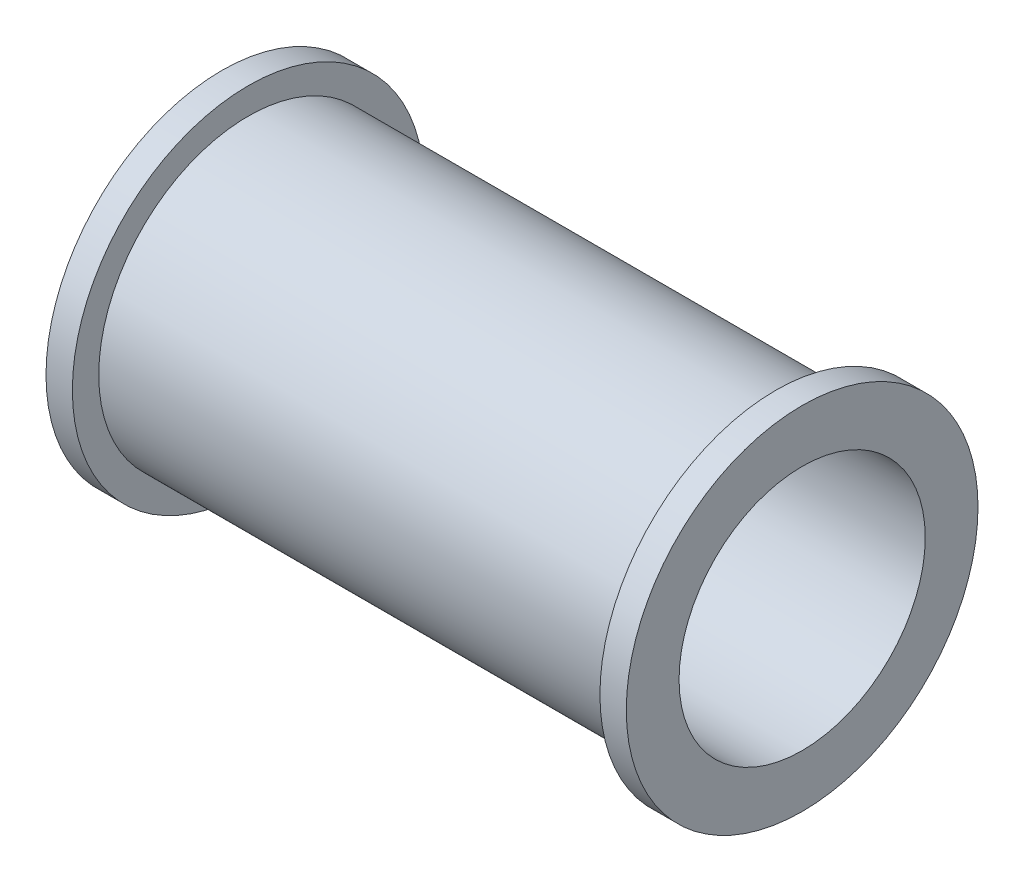
ISO-10303-21;
HEADER;
FILE_DESCRIPTION(('STEP AP214'),'2;1');
FILE_NAME('part.step','',(''),(''),'','','');
FILE_SCHEMA(('AUTOMOTIVE_DESIGN { 1 0 10303 214 1 1 1 1 }'));
ENDSEC;
DATA;
#1=APPLICATION_CONTEXT('core data for automotive mechanical design processes');
#2=APPLICATION_PROTOCOL_DEFINITION('international standard','automotive_design',2000,#1);
#3=PRODUCT_CONTEXT('',#1,'mechanical');
#4=PRODUCT('Part','Part','',(#3));
#5=PRODUCT_RELATED_PRODUCT_CATEGORY('part','',(#4));
#6=PRODUCT_DEFINITION_FORMATION('','',#4);
#7=PRODUCT_DEFINITION_CONTEXT('part definition',#1,'design');
#8=PRODUCT_DEFINITION('design','',#6,#7);
#9=PRODUCT_DEFINITION_SHAPE('','',#8);
#10=(LENGTH_UNIT() NAMED_UNIT(*) SI_UNIT(.MILLI.,.METRE.));
#11=(NAMED_UNIT(*) PLANE_ANGLE_UNIT() SI_UNIT($,.RADIAN.));
#12=(NAMED_UNIT(*) SI_UNIT($,.STERADIAN.) SOLID_ANGLE_UNIT());
#13=UNCERTAINTY_MEASURE_WITH_UNIT(LENGTH_MEASURE(1.E-05),#10,'distance_accuracy_value','');
#14=(GEOMETRIC_REPRESENTATION_CONTEXT(3) GLOBAL_UNCERTAINTY_ASSIGNED_CONTEXT((#13)) GLOBAL_UNIT_ASSIGNED_CONTEXT((#10,
#11,#12)) REPRESENTATION_CONTEXT('',''));
#15=CARTESIAN_POINT('',(0.,0.,0.));
#16=DIRECTION('',(0.,0.,1.));
#17=DIRECTION('',(1.,0.,0.));
#18=AXIS2_PLACEMENT_3D('',#15,#16,#17);
#19=CARTESIAN_POINT('',(0.,0.,0.));
#20=DIRECTION('',(-1.,0.,0.));
#21=DIRECTION('',(0.,0.,1.));
#22=AXIS2_PLACEMENT_3D('',#19,#20,#21);
#23=PLANE('',#22);
#24=CARTESIAN_POINT('',(0.,0.,0.));
#25=DIRECTION('',(1.,0.,0.));
#26=DIRECTION('',(0.,0.,-1.));
#27=AXIS2_PLACEMENT_3D('',#24,#25,#26);
#28=CIRCLE('',#27,7.);
#29=CARTESIAN_POINT('',(0.,0.,-7.));
#30=VERTEX_POINT('',#29);
#31=EDGE_CURVE('E58',#30,#30,#28,.T.);
#32=ORIENTED_EDGE('',*,*,#31,.T.);
#33=EDGE_LOOP('',(#32));
#34=FACE_BOUND('',#33,.T.);
#35=CARTESIAN_POINT('',(0.,0.,0.));
#36=DIRECTION('',(1.,0.,0.));
#37=DIRECTION('',(0.,0.,-1.));
#38=AXIS2_PLACEMENT_3D('',#35,#36,#37);
#39=CIRCLE('',#38,10.);
#40=CARTESIAN_POINT('',(0.,0.,-10.));
#41=VERTEX_POINT('',#40);
#42=EDGE_CURVE('E10',#41,#41,#39,.T.);
#43=ORIENTED_EDGE('',*,*,#42,.F.);
#44=EDGE_LOOP('',(#43));
#45=FACE_BOUND('',#44,.T.);
#46=ADVANCED_FACE('F33',(#34,#45),#23,.T.);
#47=CARTESIAN_POINT('',(33.,0.,0.));
#48=DIRECTION('',(1.,0.,0.));
#49=DIRECTION('',(0.,0.,-1.));
#50=AXIS2_PLACEMENT_3D('',#47,#48,#49);
#51=CYLINDRICAL_SURFACE('',#50,10.);
#52=ORIENTED_EDGE('',*,*,#42,.T.);
#53=EDGE_LOOP('',(#52));
#54=FACE_BOUND('',#53,.T.);
#55=CARTESIAN_POINT('',(1.5,0.,0.));
#56=DIRECTION('',(1.,0.,0.));
#57=DIRECTION('',(0.,0.,-1.));
#58=AXIS2_PLACEMENT_3D('',#55,#56,#57);
#59=CIRCLE('',#58,10.);
#60=CARTESIAN_POINT('',(1.5,0.,-10.));
#61=VERTEX_POINT('',#60);
#62=EDGE_CURVE('E39',#61,#61,#59,.T.);
#63=ORIENTED_EDGE('',*,*,#62,.F.);
#64=EDGE_LOOP('',(#63));
#65=FACE_BOUND('',#64,.T.);
#66=ADVANCED_FACE('F91',(#54,#65),#51,.T.);
#67=CARTESIAN_POINT('',(1.5,0.,-10.));
#68=DIRECTION('',(1.,0.,0.));
#69=DIRECTION('',(0.,0.,-1.));
#70=AXIS2_PLACEMENT_3D('',#67,#68,#69);
#71=PLANE('',#70);
#72=ORIENTED_EDGE('',*,*,#62,.T.);
#73=EDGE_LOOP('',(#72));
#74=FACE_BOUND('',#73,.T.);
#75=CARTESIAN_POINT('',(1.5,0.,0.));
#76=DIRECTION('',(1.,0.,0.));
#77=DIRECTION('',(0.,0.,-1.));
#78=AXIS2_PLACEMENT_3D('',#75,#76,#77);
#79=CIRCLE('',#78,8.5);
#80=CARTESIAN_POINT('',(1.5,0.,-8.5));
#81=VERTEX_POINT('',#80);
#82=EDGE_CURVE('E43',#81,#81,#79,.T.);
#83=ORIENTED_EDGE('',*,*,#82,.F.);
#84=EDGE_LOOP('',(#83));
#85=FACE_BOUND('',#84,.T.);
#86=ADVANCED_FACE('F95',(#74,#85),#71,.T.);
#87=CARTESIAN_POINT('',(33.,0.,0.));
#88=DIRECTION('',(1.,0.,0.));
#89=DIRECTION('',(0.,0.,-1.));
#90=AXIS2_PLACEMENT_3D('',#87,#88,#89);
#91=CYLINDRICAL_SURFACE('',#90,8.5);
#92=ORIENTED_EDGE('',*,*,#82,.T.);
#93=EDGE_LOOP('',(#92));
#94=FACE_BOUND('',#93,.T.);
#95=CARTESIAN_POINT('',(31.5,0.,0.));
#96=DIRECTION('',(1.,0.,0.));
#97=DIRECTION('',(0.,0.,-1.));
#98=AXIS2_PLACEMENT_3D('',#95,#96,#97);
#99=CIRCLE('',#98,8.5);
#100=CARTESIAN_POINT('',(31.5,0.,-8.5));
#101=VERTEX_POINT('',#100);
#102=EDGE_CURVE('E47',#101,#101,#99,.T.);
#103=ORIENTED_EDGE('',*,*,#102,.F.);
#104=EDGE_LOOP('',(#103));
#105=FACE_BOUND('',#104,.T.);
#106=ADVANCED_FACE('F87',(#94,#105),#91,.T.);
#107=CARTESIAN_POINT('',(31.5,0.,-10.));
#108=DIRECTION('',(-1.,0.,0.));
#109=DIRECTION('',(0.,0.,1.));
#110=AXIS2_PLACEMENT_3D('',#107,#108,#109);
#111=PLANE('',#110);
#112=ORIENTED_EDGE('',*,*,#102,.T.);
#113=EDGE_LOOP('',(#112));
#114=FACE_BOUND('',#113,.T.);
#115=CARTESIAN_POINT('',(31.5,0.,0.));
#116=DIRECTION('',(1.,0.,0.));
#117=DIRECTION('',(0.,0.,-1.));
#118=AXIS2_PLACEMENT_3D('',#115,#116,#117);
#119=CIRCLE('',#118,10.);
#120=CARTESIAN_POINT('',(31.5,0.,-10.));
#121=VERTEX_POINT('',#120);
#122=EDGE_CURVE('E52',#121,#121,#119,.T.);
#123=ORIENTED_EDGE('',*,*,#122,.F.);
#124=EDGE_LOOP('',(#123));
#125=FACE_BOUND('',#124,.T.);
#126=ADVANCED_FACE('F81',(#114,#125),#111,.T.);
#127=CARTESIAN_POINT('',(33.,0.,0.));
#128=DIRECTION('',(1.,0.,0.));
#129=DIRECTION('',(0.,0.,-1.));
#130=AXIS2_PLACEMENT_3D('',#127,#128,#129);
#131=CYLINDRICAL_SURFACE('',#130,10.);
#132=ORIENTED_EDGE('',*,*,#122,.T.);
#133=EDGE_LOOP('',(#132));
#134=FACE_BOUND('',#133,.T.);
#135=CARTESIAN_POINT('',(33.,0.,0.));
#136=DIRECTION('',(1.,0.,0.));
#137=DIRECTION('',(0.,0.,-1.));
#138=AXIS2_PLACEMENT_3D('',#135,#136,#137);
#139=CIRCLE('',#138,10.);
#140=CARTESIAN_POINT('',(33.,0.,-10.));
#141=VERTEX_POINT('',#140);
#142=EDGE_CURVE('E55',#141,#141,#139,.T.);
#143=ORIENTED_EDGE('',*,*,#142,.F.);
#144=EDGE_LOOP('',(#143));
#145=FACE_BOUND('',#144,.T.);
#146=ADVANCED_FACE('F76',(#134,#145),#131,.T.);
#147=CARTESIAN_POINT('',(33.,0.,0.));
#148=DIRECTION('',(1.,0.,0.));
#149=DIRECTION('',(0.,0.,-1.));
#150=AXIS2_PLACEMENT_3D('',#147,#148,#149);
#151=PLANE('',#150);
#152=CARTESIAN_POINT('',(33.,0.,0.));
#153=DIRECTION('',(1.,0.,0.));
#154=DIRECTION('',(0.,0.,-1.));
#155=AXIS2_PLACEMENT_3D('',#152,#153,#154);
#156=CIRCLE('',#155,7.);
#157=CARTESIAN_POINT('',(33.,0.,-7.));
#158=VERTEX_POINT('',#157);
#159=EDGE_CURVE('E59',#158,#158,#156,.T.);
#160=ORIENTED_EDGE('',*,*,#159,.F.);
#161=EDGE_LOOP('',(#160));
#162=FACE_BOUND('',#161,.T.);
#163=ORIENTED_EDGE('',*,*,#142,.T.);
#164=EDGE_LOOP('',(#163));
#165=FACE_BOUND('',#164,.T.);
#166=ADVANCED_FACE('F70',(#162,#165),#151,.T.);
#167=CARTESIAN_POINT('',(0.,0.,0.));
#168=DIRECTION('',(1.,0.,0.));
#169=DIRECTION('',(0.,0.,-1.));
#170=AXIS2_PLACEMENT_3D('',#167,#168,#169);
#171=CYLINDRICAL_SURFACE('',#170,7.);
#172=ORIENTED_EDGE('',*,*,#31,.F.);
#173=EDGE_LOOP('',(#172));
#174=FACE_BOUND('',#173,.T.);
#175=ORIENTED_EDGE('',*,*,#159,.T.);
#176=EDGE_LOOP('',(#175));
#177=FACE_BOUND('',#176,.T.);
#178=ADVANCED_FACE('F67',(#174,#177),#171,.F.);
#179=CLOSED_SHELL('',(#46,#66,#86,#106,#126,#146,#166,#178));
#180=MANIFOLD_SOLID_BREP('B2',#179);
#181=ADVANCED_BREP_SHAPE_REPRESENTATION('',(#18,#180),#14);
#182=SHAPE_DEFINITION_REPRESENTATION(#9,#181);
ENDSEC;
END-ISO-10303-21;
